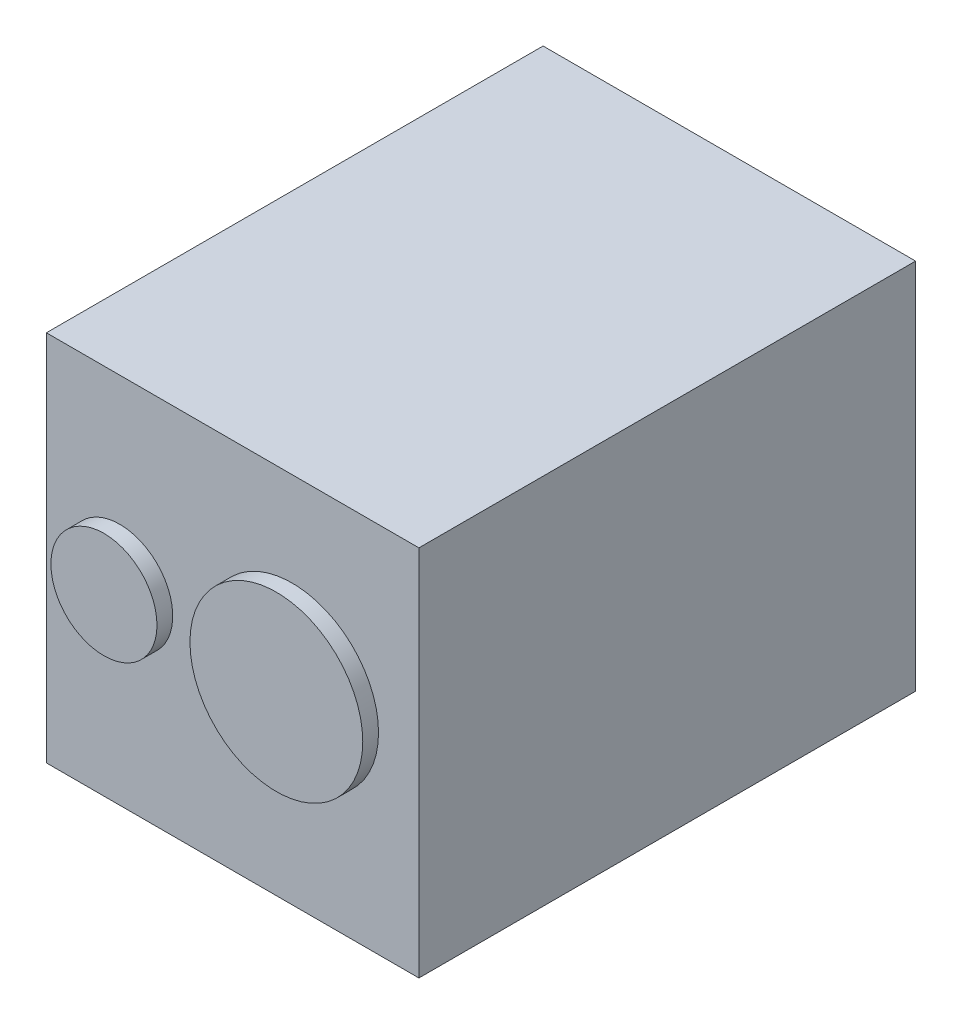
ISO-10303-21;
HEADER;
FILE_DESCRIPTION(('STEP AP214'),'2;1');
FILE_NAME('part.step','',(''),(''),'','','');
FILE_SCHEMA(('AUTOMOTIVE_DESIGN { 1 0 10303 214 1 1 1 1 }'));
ENDSEC;
DATA;
#1=APPLICATION_CONTEXT('core data for automotive mechanical design processes');
#2=APPLICATION_PROTOCOL_DEFINITION('international standard','automotive_design',2000,#1);
#3=PRODUCT_CONTEXT('',#1,'mechanical');
#4=PRODUCT('Part','Part','',(#3));
#5=PRODUCT_RELATED_PRODUCT_CATEGORY('part','',(#4));
#6=PRODUCT_DEFINITION_FORMATION('','',#4);
#7=PRODUCT_DEFINITION_CONTEXT('part definition',#1,'design');
#8=PRODUCT_DEFINITION('design','',#6,#7);
#9=PRODUCT_DEFINITION_SHAPE('','',#8);
#10=(LENGTH_UNIT() NAMED_UNIT(*) SI_UNIT(.MILLI.,.METRE.));
#11=(NAMED_UNIT(*) PLANE_ANGLE_UNIT() SI_UNIT($,.RADIAN.));
#12=(NAMED_UNIT(*) SI_UNIT($,.STERADIAN.) SOLID_ANGLE_UNIT());
#13=UNCERTAINTY_MEASURE_WITH_UNIT(LENGTH_MEASURE(1.E-05),#10,'distance_accuracy_value','');
#14=(GEOMETRIC_REPRESENTATION_CONTEXT(3) GLOBAL_UNCERTAINTY_ASSIGNED_CONTEXT((#13)) GLOBAL_UNIT_ASSIGNED_CONTEXT((#10,
#11,#12)) REPRESENTATION_CONTEXT('',''));
#15=CARTESIAN_POINT('',(0.,0.,0.));
#16=DIRECTION('',(0.,0.,1.));
#17=DIRECTION('',(1.,0.,0.));
#18=AXIS2_PLACEMENT_3D('',#15,#16,#17);
#19=CARTESIAN_POINT('',(0.,0.,400.));
#20=DIRECTION('',(1.,0.,0.));
#21=DIRECTION('',(0.,0.,-1.));
#22=AXIS2_PLACEMENT_3D('',#19,#20,#21);
#23=PLANE('',#22);
#24=DIRECTION('',(0.,-1.,0.));
#25=VECTOR('',#24,1.);
#26=CARTESIAN_POINT('',(0.,0.,0.));
#27=LINE('',#26,#25);
#28=CARTESIAN_POINT('',(0.,300.,0.));
#29=VERTEX_POINT('',#28);
#30=CARTESIAN_POINT('',(0.,0.,0.));
#31=VERTEX_POINT('',#30);
#32=EDGE_CURVE('E104',#29,#31,#27,.T.);
#33=ORIENTED_EDGE('',*,*,#32,.T.);
#34=DIRECTION('',(0.,0.,-1.));
#35=VECTOR('',#34,1.);
#36=CARTESIAN_POINT('',(0.,0.,400.));
#37=LINE('',#36,#35);
#38=CARTESIAN_POINT('',(0.,0.,400.));
#39=VERTEX_POINT('',#38);
#40=EDGE_CURVE('E95',#39,#31,#37,.T.);
#41=ORIENTED_EDGE('',*,*,#40,.F.);
#42=DIRECTION('',(0.,-1.,0.));
#43=VECTOR('',#42,1.);
#44=CARTESIAN_POINT('',(0.,0.,400.));
#45=LINE('',#44,#43);
#46=CARTESIAN_POINT('',(0.,300.,400.));
#47=VERTEX_POINT('',#46);
#48=EDGE_CURVE('E89',#47,#39,#45,.T.);
#49=ORIENTED_EDGE('',*,*,#48,.F.);
#50=DIRECTION('',(0.,0.,-1.));
#51=VECTOR('',#50,1.);
#52=CARTESIAN_POINT('',(0.,300.,400.));
#53=LINE('',#52,#51);
#54=EDGE_CURVE('E100',#47,#29,#53,.T.);
#55=ORIENTED_EDGE('',*,*,#54,.T.);
#56=EDGE_LOOP('',(#33,#41,#49,#55));
#57=FACE_BOUND('',#56,.T.);
#58=ADVANCED_FACE('F37',(#57),#23,.F.);
#59=CARTESIAN_POINT('',(0.,0.,400.));
#60=DIRECTION('',(0.,1.,0.));
#61=DIRECTION('',(0.,0.,1.));
#62=AXIS2_PLACEMENT_3D('',#59,#60,#61);
#63=PLANE('',#62);
#64=DIRECTION('',(1.,0.,0.));
#65=VECTOR('',#64,1.);
#66=CARTESIAN_POINT('',(0.,0.,0.));
#67=LINE('',#66,#65);
#68=CARTESIAN_POINT('',(300.,0.,0.));
#69=VERTEX_POINT('',#68);
#70=EDGE_CURVE('E94',#31,#69,#67,.T.);
#71=ORIENTED_EDGE('',*,*,#70,.T.);
#72=DIRECTION('',(0.,0.,-1.));
#73=VECTOR('',#72,1.);
#74=CARTESIAN_POINT('',(300.,0.,400.));
#75=LINE('',#74,#73);
#76=CARTESIAN_POINT('',(300.,0.,400.));
#77=VERTEX_POINT('',#76);
#78=EDGE_CURVE('E92',#77,#69,#75,.T.);
#79=ORIENTED_EDGE('',*,*,#78,.F.);
#80=DIRECTION('',(1.,0.,0.));
#81=VECTOR('',#80,1.);
#82=CARTESIAN_POINT('',(0.,0.,400.));
#83=LINE('',#82,#81);
#84=EDGE_CURVE('E84',#39,#77,#83,.T.);
#85=ORIENTED_EDGE('',*,*,#84,.F.);
#86=ORIENTED_EDGE('',*,*,#40,.T.);
#87=EDGE_LOOP('',(#71,#79,#85,#86));
#88=FACE_BOUND('',#87,.T.);
#89=ADVANCED_FACE('F93',(#88),#63,.F.);
#90=CARTESIAN_POINT('',(300.,0.,400.));
#91=DIRECTION('',(-1.,0.,0.));
#92=DIRECTION('',(0.,0.,1.));
#93=AXIS2_PLACEMENT_3D('',#90,#91,#92);
#94=PLANE('',#93);
#95=DIRECTION('',(0.,1.,0.));
#96=VECTOR('',#95,1.);
#97=CARTESIAN_POINT('',(300.,0.,0.));
#98=LINE('',#97,#96);
#99=CARTESIAN_POINT('',(300.,300.,0.));
#100=VERTEX_POINT('',#99);
#101=EDGE_CURVE('E70',#69,#100,#98,.T.);
#102=ORIENTED_EDGE('',*,*,#101,.T.);
#103=DIRECTION('',(0.,0.,-1.));
#104=VECTOR('',#103,1.);
#105=CARTESIAN_POINT('',(300.,300.,400.));
#106=LINE('',#105,#104);
#107=CARTESIAN_POINT('',(300.,300.,400.));
#108=VERTEX_POINT('',#107);
#109=EDGE_CURVE('E96',#108,#100,#106,.T.);
#110=ORIENTED_EDGE('',*,*,#109,.F.);
#111=DIRECTION('',(0.,1.,0.));
#112=VECTOR('',#111,1.);
#113=CARTESIAN_POINT('',(300.,0.,400.));
#114=LINE('',#113,#112);
#115=EDGE_CURVE('E87',#77,#108,#114,.T.);
#116=ORIENTED_EDGE('',*,*,#115,.F.);
#117=ORIENTED_EDGE('',*,*,#78,.T.);
#118=EDGE_LOOP('',(#102,#110,#116,#117));
#119=FACE_BOUND('',#118,.T.);
#120=ADVANCED_FACE('F98',(#119),#94,.F.);
#121=CARTESIAN_POINT('',(0.,300.,400.));
#122=DIRECTION('',(0.,-1.,0.));
#123=DIRECTION('',(0.,0.,-1.));
#124=AXIS2_PLACEMENT_3D('',#121,#122,#123);
#125=PLANE('',#124);
#126=DIRECTION('',(-1.,0.,0.));
#127=VECTOR('',#126,1.);
#128=CARTESIAN_POINT('',(0.,300.,0.));
#129=LINE('',#128,#127);
#130=EDGE_CURVE('E76',#100,#29,#129,.T.);
#131=ORIENTED_EDGE('',*,*,#130,.T.);
#132=ORIENTED_EDGE('',*,*,#54,.F.);
#133=DIRECTION('',(-1.,0.,0.));
#134=VECTOR('',#133,1.);
#135=CARTESIAN_POINT('',(0.,300.,400.));
#136=LINE('',#135,#134);
#137=EDGE_CURVE('E53',#108,#47,#136,.T.);
#138=ORIENTED_EDGE('',*,*,#137,.F.);
#139=ORIENTED_EDGE('',*,*,#109,.T.);
#140=EDGE_LOOP('',(#131,#132,#138,#139));
#141=FACE_BOUND('',#140,.T.);
#142=ADVANCED_FACE('F120',(#141),#125,.F.);
#143=CARTESIAN_POINT('',(0.,0.,400.));
#144=DIRECTION('',(0.,0.,-1.));
#145=DIRECTION('',(-1.,0.,0.));
#146=AXIS2_PLACEMENT_3D('',#143,#144,#145);
#147=PLANE('',#146);
#148=CARTESIAN_POINT('',(197.894381644517,154.860769065834,400.));
#149=DIRECTION('',(0.,0.,-1.));
#150=DIRECTION('',(-1.,0.,0.));
#151=AXIS2_PLACEMENT_3D('',#148,#149,#150);
#152=CIRCLE('',#151,69.5879933539219);
#153=CARTESIAN_POINT('',(128.306388290595,154.860769065834,400.));
#154=VERTEX_POINT('',#153);
#155=EDGE_CURVE('E11',#154,#154,#152,.F.);
#156=ORIENTED_EDGE('',*,*,#155,.F.);
#157=EDGE_LOOP('',(#156));
#158=FACE_BOUND('',#157,.T.);
#159=CARTESIAN_POINT('',(59.0509985033663,153.288809658605,400.));
#160=DIRECTION('',(0.,0.,-1.));
#161=DIRECTION('',(-1.,0.,0.));
#162=AXIS2_PLACEMENT_3D('',#159,#160,#161);
#163=CIRCLE('',#162,42.7045959910402);
#164=CARTESIAN_POINT('',(16.3464025123261,153.288809658605,400.));
#165=VERTEX_POINT('',#164);
#166=EDGE_CURVE('E45',#165,#165,#163,.F.);
#167=ORIENTED_EDGE('',*,*,#166,.F.);
#168=EDGE_LOOP('',(#167));
#169=FACE_BOUND('',#168,.T.);
#170=ORIENTED_EDGE('',*,*,#48,.T.);
#171=ORIENTED_EDGE('',*,*,#84,.T.);
#172=ORIENTED_EDGE('',*,*,#115,.T.);
#173=ORIENTED_EDGE('',*,*,#137,.T.);
#174=EDGE_LOOP('',(#170,#171,#172,#173));
#175=FACE_BOUND('',#174,.T.);
#176=ADVANCED_FACE('F85',(#158,#169,#175),#147,.F.);
#177=CARTESIAN_POINT('',(0.,0.,0.));
#178=DIRECTION('',(0.,0.,-1.));
#179=DIRECTION('',(-1.,0.,0.));
#180=AXIS2_PLACEMENT_3D('',#177,#178,#179);
#181=PLANE('',#180);
#182=ORIENTED_EDGE('',*,*,#32,.F.);
#183=ORIENTED_EDGE('',*,*,#130,.F.);
#184=ORIENTED_EDGE('',*,*,#101,.F.);
#185=ORIENTED_EDGE('',*,*,#70,.F.);
#186=EDGE_LOOP('',(#182,#183,#184,#185));
#187=FACE_BOUND('',#186,.T.);
#188=ADVANCED_FACE('F119',(#187),#181,.T.);
#189=CARTESIAN_POINT('',(59.0509985033663,153.288809658605,412.7));
#190=DIRECTION('',(0.,0.,-1.));
#191=DIRECTION('',(-1.,0.,0.));
#192=AXIS2_PLACEMENT_3D('',#189,#190,#191);
#193=CYLINDRICAL_SURFACE('',#192,42.7045959910402);
#194=CARTESIAN_POINT('',(59.0509985033663,153.288809658605,412.7));
#195=DIRECTION('',(0.,0.,1.));
#196=DIRECTION('',(1.,0.,0.));
#197=AXIS2_PLACEMENT_3D('',#194,#195,#196);
#198=CIRCLE('',#197,42.7045959910402);
#199=CARTESIAN_POINT('',(101.755594494406,153.288809658605,412.7));
#200=VERTEX_POINT('',#199);
#201=EDGE_CURVE('E107',#200,#200,#198,.T.);
#202=ORIENTED_EDGE('',*,*,#201,.F.);
#203=EDGE_LOOP('',(#202));
#204=FACE_BOUND('',#203,.T.);
#205=ORIENTED_EDGE('',*,*,#166,.T.);
#206=EDGE_LOOP('',(#205));
#207=FACE_BOUND('',#206,.T.);
#208=ADVANCED_FACE('F116',(#204,#207),#193,.T.);
#209=CARTESIAN_POINT('',(59.0509985033663,153.288809658605,412.7));
#210=DIRECTION('',(0.,0.,1.));
#211=DIRECTION('',(1.,0.,0.));
#212=AXIS2_PLACEMENT_3D('',#209,#210,#211);
#213=PLANE('',#212);
#214=ORIENTED_EDGE('',*,*,#201,.T.);
#215=EDGE_LOOP('',(#214));
#216=FACE_BOUND('',#215,.T.);
#217=ADVANCED_FACE('F150',(#216),#213,.T.);
#218=CARTESIAN_POINT('',(197.894381644517,154.860769065834,412.7));
#219=DIRECTION('',(0.,0.,-1.));
#220=DIRECTION('',(-1.,0.,0.));
#221=AXIS2_PLACEMENT_3D('',#218,#219,#220);
#222=CYLINDRICAL_SURFACE('',#221,69.5879933539219);
#223=CARTESIAN_POINT('',(197.894381644517,154.860769065834,412.7));
#224=DIRECTION('',(0.,0.,1.));
#225=DIRECTION('',(1.,0.,0.));
#226=AXIS2_PLACEMENT_3D('',#223,#224,#225);
#227=CIRCLE('',#226,69.5879933539219);
#228=CARTESIAN_POINT('',(267.482374998439,154.860769065834,412.7));
#229=VERTEX_POINT('',#228);
#230=EDGE_CURVE('E141',#229,#229,#227,.T.);
#231=ORIENTED_EDGE('',*,*,#230,.F.);
#232=EDGE_LOOP('',(#231));
#233=FACE_BOUND('',#232,.T.);
#234=ORIENTED_EDGE('',*,*,#155,.T.);
#235=EDGE_LOOP('',(#234));
#236=FACE_BOUND('',#235,.T.);
#237=ADVANCED_FACE('F147',(#233,#236),#222,.T.);
#238=CARTESIAN_POINT('',(197.894381644517,154.860769065834,412.7));
#239=DIRECTION('',(0.,0.,1.));
#240=DIRECTION('',(1.,0.,0.));
#241=AXIS2_PLACEMENT_3D('',#238,#239,#240);
#242=PLANE('',#241);
#243=ORIENTED_EDGE('',*,*,#230,.T.);
#244=EDGE_LOOP('',(#243));
#245=FACE_BOUND('',#244,.T.);
#246=ADVANCED_FACE('F145',(#245),#242,.T.);
#247=CLOSED_SHELL('',(#58,#89,#120,#142,#176,#188,#208,#217,#237,#246));
#248=MANIFOLD_SOLID_BREP('B2',#247);
#249=ADVANCED_BREP_SHAPE_REPRESENTATION('',(#18,#248),#14);
#250=SHAPE_DEFINITION_REPRESENTATION(#9,#249);
ENDSEC;
END-ISO-10303-21;
